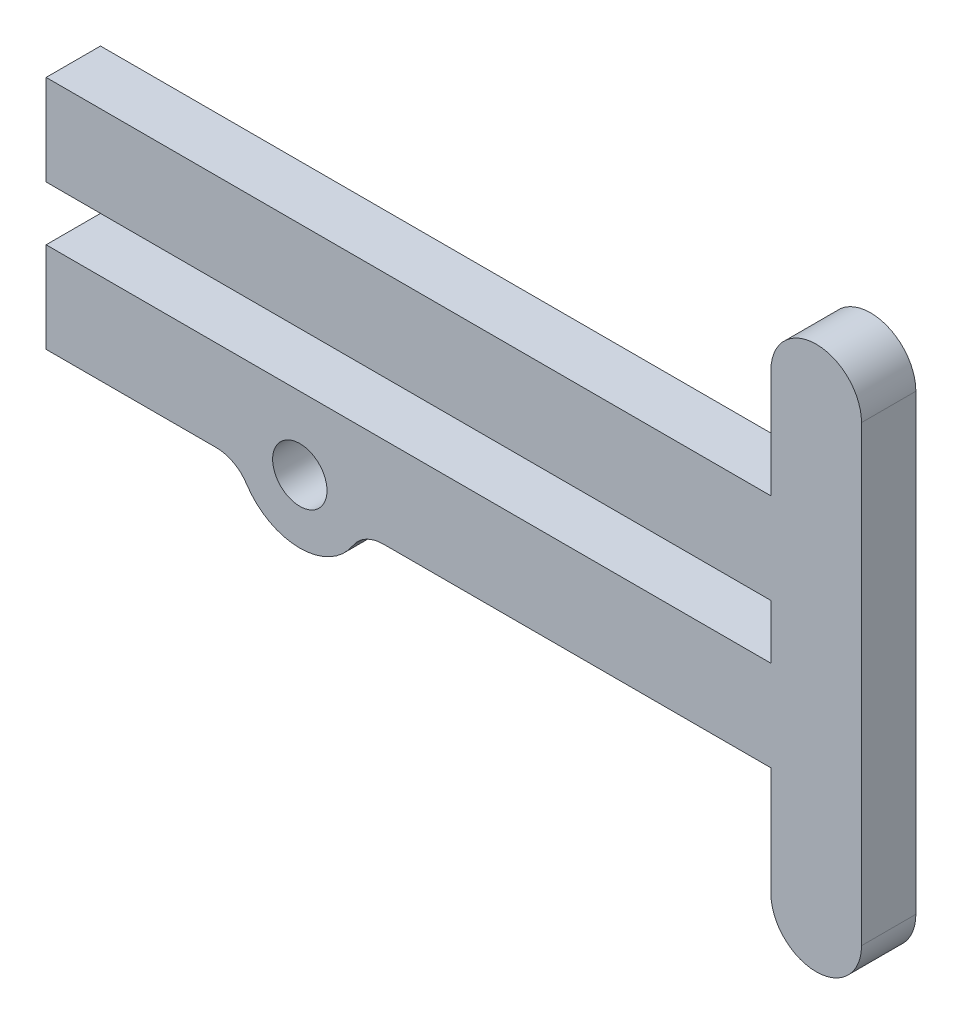
ISO-10303-21;
HEADER;
FILE_DESCRIPTION(('STEP AP214'),'2;1');
FILE_NAME('part.step','',(''),(''),'','','');
FILE_SCHEMA(('AUTOMOTIVE_DESIGN { 1 0 10303 214 1 1 1 1 }'));
ENDSEC;
DATA;
#1=APPLICATION_CONTEXT('core data for automotive mechanical design processes');
#2=APPLICATION_PROTOCOL_DEFINITION('international standard','automotive_design',2000,#1);
#3=PRODUCT_CONTEXT('',#1,'mechanical');
#4=PRODUCT('Part','Part','',(#3));
#5=PRODUCT_RELATED_PRODUCT_CATEGORY('part','',(#4));
#6=PRODUCT_DEFINITION_FORMATION('','',#4);
#7=PRODUCT_DEFINITION_CONTEXT('part definition',#1,'design');
#8=PRODUCT_DEFINITION('design','',#6,#7);
#9=PRODUCT_DEFINITION_SHAPE('','',#8);
#10=(LENGTH_UNIT() NAMED_UNIT(*) SI_UNIT(.MILLI.,.METRE.));
#11=(NAMED_UNIT(*) PLANE_ANGLE_UNIT() SI_UNIT($,.RADIAN.));
#12=(NAMED_UNIT(*) SI_UNIT($,.STERADIAN.) SOLID_ANGLE_UNIT());
#13=UNCERTAINTY_MEASURE_WITH_UNIT(LENGTH_MEASURE(1.E-05),#10,'distance_accuracy_value','');
#14=(GEOMETRIC_REPRESENTATION_CONTEXT(3) GLOBAL_UNCERTAINTY_ASSIGNED_CONTEXT((#13)) GLOBAL_UNIT_ASSIGNED_CONTEXT((#10,
#11,#12)) REPRESENTATION_CONTEXT('',''));
#15=CARTESIAN_POINT('',(0.,0.,0.));
#16=DIRECTION('',(0.,0.,1.));
#17=DIRECTION('',(1.,0.,0.));
#18=AXIS2_PLACEMENT_3D('',#15,#16,#17);
#19=CARTESIAN_POINT('',(0.,-13.,3.));
#20=DIRECTION('',(0.,1.,0.));
#21=DIRECTION('',(-1.,0.,0.));
#22=AXIS2_PLACEMENT_3D('',#19,#20,#21);
#23=PLANE('',#22);
#24=DIRECTION('',(1.,0.,0.));
#25=VECTOR('',#24,1.);
#26=CARTESIAN_POINT('',(0.,-13.,3.));
#27=LINE('',#26,#25);
#28=CARTESIAN_POINT('',(-26.3902277713535,-13.,3.));
#29=VERTEX_POINT('',#28);
#30=CARTESIAN_POINT('',(-5.,-13.,3.));
#31=VERTEX_POINT('',#30);
#32=EDGE_CURVE('E217',#29,#31,#27,.T.);
#33=ORIENTED_EDGE('',*,*,#32,.F.);
#34=DIRECTION('',(0.,0.,1.));
#35=VECTOR('',#34,1.);
#36=CARTESIAN_POINT('',(-26.3902277713536,-13.,3.));
#37=LINE('',#36,#35);
#38=CARTESIAN_POINT('',(-26.3902277713535,-13.,0.));
#39=VERTEX_POINT('',#38);
#40=EDGE_CURVE('E267',#29,#39,#37,.F.);
#41=ORIENTED_EDGE('',*,*,#40,.T.);
#42=DIRECTION('',(1.,0.,0.));
#43=VECTOR('',#42,1.);
#44=CARTESIAN_POINT('',(0.,-13.,0.));
#45=LINE('',#44,#43);
#46=CARTESIAN_POINT('',(-5.,-13.,0.));
#47=VERTEX_POINT('',#46);
#48=EDGE_CURVE('E236',#39,#47,#45,.T.);
#49=ORIENTED_EDGE('',*,*,#48,.T.);
#50=DIRECTION('',(0.,0.,-1.));
#51=VECTOR('',#50,1.);
#52=CARTESIAN_POINT('',(-5.,-13.,3.));
#53=LINE('',#52,#51);
#54=EDGE_CURVE('E191',#31,#47,#53,.T.);
#55=ORIENTED_EDGE('',*,*,#54,.F.);
#56=EDGE_LOOP('',(#33,#41,#49,#55));
#57=FACE_BOUND('',#56,.T.);
#58=ADVANCED_FACE('F35',(#57),#23,.F.);
#59=CARTESIAN_POINT('',(-45.,0.,3.));
#60=DIRECTION('',(0.,-1.,0.));
#61=DIRECTION('',(0.,0.,-1.));
#62=AXIS2_PLACEMENT_3D('',#59,#60,#61);
#63=PLANE('',#62);
#64=DIRECTION('',(0.,0.,1.));
#65=VECTOR('',#64,1.);
#66=CARTESIAN_POINT('',(-5.,0.,3.));
#67=LINE('',#66,#65);
#68=CARTESIAN_POINT('',(-5.,0.,0.));
#69=VERTEX_POINT('',#68);
#70=CARTESIAN_POINT('',(-5.00000000000001,0.,3.));
#71=VERTEX_POINT('',#70);
#72=EDGE_CURVE('E189',#69,#71,#67,.T.);
#73=ORIENTED_EDGE('',*,*,#72,.F.);
#74=DIRECTION('',(-1.,0.,0.));
#75=VECTOR('',#74,1.);
#76=CARTESIAN_POINT('',(-45.,0.,0.));
#77=LINE('',#76,#75);
#78=CARTESIAN_POINT('',(-45.,0.,0.));
#79=VERTEX_POINT('',#78);
#80=EDGE_CURVE('E168',#69,#79,#77,.T.);
#81=ORIENTED_EDGE('',*,*,#80,.T.);
#82=DIRECTION('',(0.,0.,-1.));
#83=VECTOR('',#82,1.);
#84=CARTESIAN_POINT('',(-45.,0.,3.));
#85=LINE('',#84,#83);
#86=CARTESIAN_POINT('',(-45.,0.,3.));
#87=VERTEX_POINT('',#86);
#88=EDGE_CURVE('E225',#87,#79,#85,.T.);
#89=ORIENTED_EDGE('',*,*,#88,.F.);
#90=DIRECTION('',(-1.,0.,0.));
#91=VECTOR('',#90,1.);
#92=CARTESIAN_POINT('',(-45.,0.,3.));
#93=LINE('',#92,#91);
#94=EDGE_CURVE('E223',#71,#87,#93,.T.);
#95=ORIENTED_EDGE('',*,*,#94,.F.);
#96=EDGE_LOOP('',(#73,#81,#89,#95));
#97=FACE_BOUND('',#96,.T.);
#98=ADVANCED_FACE('F313',(#97),#63,.F.);
#99=CARTESIAN_POINT('',(-45.,-13.,0.));
#100=VERTEX_POINT('',#99);
#101=CARTESIAN_POINT('',(-35.6097722286464,-13.,0.));
#102=VERTEX_POINT('',#101);
#103=EDGE_CURVE('E237',#100,#102,#45,.T.);
#104=ORIENTED_EDGE('',*,*,#103,.T.);
#105=DIRECTION('',(0.,0.,1.));
#106=VECTOR('',#105,1.);
#107=CARTESIAN_POINT('',(-35.6097722286464,-13.,3.));
#108=LINE('',#107,#106);
#109=CARTESIAN_POINT('',(-35.6097722286464,-13.,3.));
#110=VERTEX_POINT('',#109);
#111=EDGE_CURVE('E260',#102,#110,#108,.T.);
#112=ORIENTED_EDGE('',*,*,#111,.T.);
#113=CARTESIAN_POINT('',(-45.,-13.,3.));
#114=VERTEX_POINT('',#113);
#115=EDGE_CURVE('E218',#114,#110,#27,.T.);
#116=ORIENTED_EDGE('',*,*,#115,.F.);
#117=DIRECTION('',(0.,0.,-1.));
#118=VECTOR('',#117,1.);
#119=CARTESIAN_POINT('',(-45.,-13.,3.));
#120=LINE('',#119,#118);
#121=EDGE_CURVE('E245',#114,#100,#120,.T.);
#122=ORIENTED_EDGE('',*,*,#121,.T.);
#123=EDGE_LOOP('',(#104,#112,#116,#122));
#124=FACE_BOUND('',#123,.T.);
#125=ADVANCED_FACE('F314',(#124),#23,.F.);
#126=CARTESIAN_POINT('',(-45.,-5.,3.));
#127=DIRECTION('',(1.,0.,0.));
#128=DIRECTION('',(0.,0.,-1.));
#129=AXIS2_PLACEMENT_3D('',#126,#127,#128);
#130=PLANE('',#129);
#131=DIRECTION('',(0.,-1.,0.));
#132=VECTOR('',#131,1.);
#133=CARTESIAN_POINT('',(-45.,-5.,0.));
#134=LINE('',#133,#132);
#135=CARTESIAN_POINT('',(-45.,-5.,0.));
#136=VERTEX_POINT('',#135);
#137=EDGE_CURVE('E205',#79,#136,#134,.T.);
#138=ORIENTED_EDGE('',*,*,#137,.T.);
#139=DIRECTION('',(0.,0.,-1.));
#140=VECTOR('',#139,1.);
#141=CARTESIAN_POINT('',(-45.,-5.,3.));
#142=LINE('',#141,#140);
#143=CARTESIAN_POINT('',(-45.,-5.,3.));
#144=VERTEX_POINT('',#143);
#145=EDGE_CURVE('E257',#144,#136,#142,.T.);
#146=ORIENTED_EDGE('',*,*,#145,.F.);
#147=DIRECTION('',(0.,-1.,0.));
#148=VECTOR('',#147,1.);
#149=CARTESIAN_POINT('',(-45.,-5.,3.));
#150=LINE('',#149,#148);
#151=EDGE_CURVE('E206',#87,#144,#150,.T.);
#152=ORIENTED_EDGE('',*,*,#151,.F.);
#153=ORIENTED_EDGE('',*,*,#88,.T.);
#154=EDGE_LOOP('',(#138,#146,#152,#153));
#155=FACE_BOUND('',#154,.T.);
#156=ADVANCED_FACE('F321',(#155),#130,.F.);
#157=CARTESIAN_POINT('',(-5.,-5.,3.));
#158=DIRECTION('',(0.,1.,0.));
#159=DIRECTION('',(-1.,0.,0.));
#160=AXIS2_PLACEMENT_3D('',#157,#158,#159);
#161=PLANE('',#160);
#162=DIRECTION('',(1.,0.,0.));
#163=VECTOR('',#162,1.);
#164=CARTESIAN_POINT('',(-5.,-5.,0.));
#165=LINE('',#164,#163);
#166=CARTESIAN_POINT('',(-5.,-5.,0.));
#167=VERTEX_POINT('',#166);
#168=EDGE_CURVE('E228',#136,#167,#165,.T.);
#169=ORIENTED_EDGE('',*,*,#168,.T.);
#170=DIRECTION('',(0.,0.,-1.));
#171=VECTOR('',#170,1.);
#172=CARTESIAN_POINT('',(-5.,-5.,3.));
#173=LINE('',#172,#171);
#174=CARTESIAN_POINT('',(-5.,-5.,3.));
#175=VERTEX_POINT('',#174);
#176=EDGE_CURVE('E254',#175,#167,#173,.T.);
#177=ORIENTED_EDGE('',*,*,#176,.F.);
#178=DIRECTION('',(1.,0.,0.));
#179=VECTOR('',#178,1.);
#180=CARTESIAN_POINT('',(-5.,-5.,3.));
#181=LINE('',#180,#179);
#182=EDGE_CURVE('E209',#144,#175,#181,.T.);
#183=ORIENTED_EDGE('',*,*,#182,.F.);
#184=ORIENTED_EDGE('',*,*,#145,.T.);
#185=EDGE_LOOP('',(#169,#177,#183,#184));
#186=FACE_BOUND('',#185,.T.);
#187=ADVANCED_FACE('F326',(#186),#161,.F.);
#188=CARTESIAN_POINT('',(-5.,-8.,3.));
#189=DIRECTION('',(1.,0.,0.));
#190=DIRECTION('',(0.,0.,-1.));
#191=AXIS2_PLACEMENT_3D('',#188,#189,#190);
#192=PLANE('',#191);
#193=DIRECTION('',(0.,-1.,0.));
#194=VECTOR('',#193,1.);
#195=CARTESIAN_POINT('',(-5.,-8.,0.));
#196=LINE('',#195,#194);
#197=CARTESIAN_POINT('',(-5.,-8.,0.));
#198=VERTEX_POINT('',#197);
#199=EDGE_CURVE('E230',#167,#198,#196,.T.);
#200=ORIENTED_EDGE('',*,*,#199,.T.);
#201=DIRECTION('',(0.,0.,-1.));
#202=VECTOR('',#201,1.);
#203=CARTESIAN_POINT('',(-5.,-8.,3.));
#204=LINE('',#203,#202);
#205=CARTESIAN_POINT('',(-5.,-8.,3.));
#206=VERTEX_POINT('',#205);
#207=EDGE_CURVE('E251',#206,#198,#204,.T.);
#208=ORIENTED_EDGE('',*,*,#207,.F.);
#209=DIRECTION('',(0.,-1.,0.));
#210=VECTOR('',#209,1.);
#211=CARTESIAN_POINT('',(-5.,-8.,3.));
#212=LINE('',#211,#210);
#213=EDGE_CURVE('E211',#175,#206,#212,.T.);
#214=ORIENTED_EDGE('',*,*,#213,.F.);
#215=ORIENTED_EDGE('',*,*,#176,.T.);
#216=EDGE_LOOP('',(#200,#208,#214,#215));
#217=FACE_BOUND('',#216,.T.);
#218=ADVANCED_FACE('F344',(#217),#192,.F.);
#219=CARTESIAN_POINT('',(-45.,-8.,3.));
#220=DIRECTION('',(0.,-1.,0.));
#221=DIRECTION('',(0.,0.,-1.));
#222=AXIS2_PLACEMENT_3D('',#219,#220,#221);
#223=PLANE('',#222);
#224=DIRECTION('',(-1.,0.,0.));
#225=VECTOR('',#224,1.);
#226=CARTESIAN_POINT('',(-45.,-8.,0.));
#227=LINE('',#226,#225);
#228=CARTESIAN_POINT('',(-45.,-8.,0.));
#229=VERTEX_POINT('',#228);
#230=EDGE_CURVE('E232',#198,#229,#227,.T.);
#231=ORIENTED_EDGE('',*,*,#230,.T.);
#232=DIRECTION('',(0.,0.,-1.));
#233=VECTOR('',#232,1.);
#234=CARTESIAN_POINT('',(-45.,-8.,3.));
#235=LINE('',#234,#233);
#236=CARTESIAN_POINT('',(-45.,-8.,3.));
#237=VERTEX_POINT('',#236);
#238=EDGE_CURVE('E248',#237,#229,#235,.T.);
#239=ORIENTED_EDGE('',*,*,#238,.F.);
#240=DIRECTION('',(-1.,0.,0.));
#241=VECTOR('',#240,1.);
#242=CARTESIAN_POINT('',(-45.,-8.,3.));
#243=LINE('',#242,#241);
#244=EDGE_CURVE('E213',#206,#237,#243,.T.);
#245=ORIENTED_EDGE('',*,*,#244,.F.);
#246=ORIENTED_EDGE('',*,*,#207,.T.);
#247=EDGE_LOOP('',(#231,#239,#245,#246));
#248=FACE_BOUND('',#247,.T.);
#249=ADVANCED_FACE('F307',(#248),#223,.F.);
#250=CARTESIAN_POINT('',(-45.,-13.,3.));
#251=DIRECTION('',(1.,0.,0.));
#252=DIRECTION('',(0.,0.,-1.));
#253=AXIS2_PLACEMENT_3D('',#250,#251,#252);
#254=PLANE('',#253);
#255=DIRECTION('',(0.,-1.,0.));
#256=VECTOR('',#255,1.);
#257=CARTESIAN_POINT('',(-45.,-13.,0.));
#258=LINE('',#257,#256);
#259=EDGE_CURVE('E234',#229,#100,#258,.T.);
#260=ORIENTED_EDGE('',*,*,#259,.T.);
#261=ORIENTED_EDGE('',*,*,#121,.F.);
#262=DIRECTION('',(0.,-1.,0.));
#263=VECTOR('',#262,1.);
#264=CARTESIAN_POINT('',(-45.,-13.,3.));
#265=LINE('',#264,#263);
#266=EDGE_CURVE('E215',#237,#114,#265,.T.);
#267=ORIENTED_EDGE('',*,*,#266,.F.);
#268=ORIENTED_EDGE('',*,*,#238,.T.);
#269=EDGE_LOOP('',(#260,#261,#267,#268));
#270=FACE_BOUND('',#269,.T.);
#271=ADVANCED_FACE('F299',(#270),#254,.F.);
#272=CARTESIAN_POINT('',(0.,0.,3.));
#273=DIRECTION('',(-1.,0.,0.));
#274=DIRECTION('',(0.,-1.,0.));
#275=AXIS2_PLACEMENT_3D('',#272,#273,#274);
#276=PLANE('',#275);
#277=DIRECTION('',(0.,1.,0.));
#278=VECTOR('',#277,1.);
#279=CARTESIAN_POINT('',(0.,0.,0.));
#280=LINE('',#279,#278);
#281=CARTESIAN_POINT('',(0.,-19.,0.));
#282=VERTEX_POINT('',#281);
#283=CARTESIAN_POINT('',(0.,6.,0.));
#284=VERTEX_POINT('',#283);
#285=EDGE_CURVE('E240',#282,#284,#280,.T.);
#286=ORIENTED_EDGE('',*,*,#285,.T.);
#287=DIRECTION('',(0.,0.,-1.));
#288=VECTOR('',#287,1.);
#289=CARTESIAN_POINT('',(0.,6.,33.4138126514911));
#290=LINE('',#289,#288);
#291=CARTESIAN_POINT('',(0.,6.,3.));
#292=VERTEX_POINT('',#291);
#293=EDGE_CURVE('E175',#292,#284,#290,.T.);
#294=ORIENTED_EDGE('',*,*,#293,.F.);
#295=DIRECTION('',(0.,1.,0.));
#296=VECTOR('',#295,1.);
#297=CARTESIAN_POINT('',(0.,0.,3.));
#298=LINE('',#297,#296);
#299=CARTESIAN_POINT('',(0.,-19.,3.));
#300=VERTEX_POINT('',#299);
#301=EDGE_CURVE('E221',#300,#292,#298,.T.);
#302=ORIENTED_EDGE('',*,*,#301,.F.);
#303=DIRECTION('',(0.,0.,-1.));
#304=VECTOR('',#303,1.);
#305=CARTESIAN_POINT('',(0.,-19.,33.4138126514911));
#306=LINE('',#305,#304);
#307=EDGE_CURVE('E184',#300,#282,#306,.T.);
#308=ORIENTED_EDGE('',*,*,#307,.T.);
#309=EDGE_LOOP('',(#286,#294,#302,#308));
#310=FACE_BOUND('',#309,.T.);
#311=ADVANCED_FACE('F297',(#310),#276,.F.);
#312=CARTESIAN_POINT('',(0.,0.,3.));
#313=DIRECTION('',(0.,0.,-1.));
#314=DIRECTION('',(-1.,0.,0.));
#315=AXIS2_PLACEMENT_3D('',#312,#313,#314);
#316=PLANE('',#315);
#317=ORIENTED_EDGE('',*,*,#301,.T.);
#318=CARTESIAN_POINT('',(-2.5,6.,3.));
#319=DIRECTION('',(0.,0.,-1.));
#320=DIRECTION('',(-1.,0.,0.));
#321=AXIS2_PLACEMENT_3D('',#318,#319,#320);
#322=CIRCLE('',#321,2.5);
#323=CARTESIAN_POINT('',(-5.,6.,3.));
#324=VERTEX_POINT('',#323);
#325=EDGE_CURVE('E178',#324,#292,#322,.T.);
#326=ORIENTED_EDGE('',*,*,#325,.F.);
#327=DIRECTION('',(0.,1.,0.));
#328=VECTOR('',#327,1.);
#329=CARTESIAN_POINT('',(-5.,6.,3.));
#330=LINE('',#329,#328);
#331=EDGE_CURVE('E152',#71,#324,#330,.T.);
#332=ORIENTED_EDGE('',*,*,#331,.F.);
#333=ORIENTED_EDGE('',*,*,#94,.T.);
#334=ORIENTED_EDGE('',*,*,#151,.T.);
#335=ORIENTED_EDGE('',*,*,#182,.T.);
#336=ORIENTED_EDGE('',*,*,#213,.T.);
#337=ORIENTED_EDGE('',*,*,#244,.T.);
#338=ORIENTED_EDGE('',*,*,#266,.T.);
#339=ORIENTED_EDGE('',*,*,#115,.T.);
#340=CARTESIAN_POINT('',(-35.6097722286464,-15.,3.));
#341=DIRECTION('',(0.,0.,-1.));
#342=DIRECTION('',(-1.,0.,0.));
#343=AXIS2_PLACEMENT_3D('',#340,#341,#342);
#344=CIRCLE('',#343,2.);
#345=CARTESIAN_POINT('',(-33.9334914182296,-13.9090909090909,3.));
#346=VERTEX_POINT('',#345);
#347=EDGE_CURVE('E269',#110,#346,#344,.T.);
#348=ORIENTED_EDGE('',*,*,#347,.T.);
#349=CARTESIAN_POINT('',(-31.,-12.,3.));
#350=DIRECTION('',(0.,0.,1.));
#351=DIRECTION('',(1.,0.,0.));
#352=AXIS2_PLACEMENT_3D('',#349,#350,#351);
#353=CIRCLE('',#352,3.5);
#354=CARTESIAN_POINT('',(-28.0665085817704,-13.9090909090909,3.));
#355=VERTEX_POINT('',#354);
#356=EDGE_CURVE('E198',#346,#355,#353,.T.);
#357=ORIENTED_EDGE('',*,*,#356,.T.);
#358=CARTESIAN_POINT('',(-26.3902277713536,-15.,3.));
#359=DIRECTION('',(0.,0.,-1.));
#360=DIRECTION('',(-1.,0.,0.));
#361=AXIS2_PLACEMENT_3D('',#358,#359,#360);
#362=CIRCLE('',#361,2.);
#363=EDGE_CURVE('E11',#355,#29,#362,.T.);
#364=ORIENTED_EDGE('',*,*,#363,.T.);
#365=ORIENTED_EDGE('',*,*,#32,.T.);
#366=CARTESIAN_POINT('',(-5.,-19.,3.));
#367=VERTEX_POINT('',#366);
#368=EDGE_CURVE('E286',#367,#31,#330,.T.);
#369=ORIENTED_EDGE('',*,*,#368,.F.);
#370=CARTESIAN_POINT('',(-2.5,-19.,3.));
#371=DIRECTION('',(0.,0.,-1.));
#372=DIRECTION('',(-1.,0.,0.));
#373=AXIS2_PLACEMENT_3D('',#370,#371,#372);
#374=CIRCLE('',#373,2.5);
#375=EDGE_CURVE('E157',#300,#367,#374,.T.);
#376=ORIENTED_EDGE('',*,*,#375,.F.);
#377=EDGE_LOOP('',(#317,#326,#332,#333,#334,#335,#336,#337,#338,#339,#348,#357,#364,#365,#369,#376));
#378=FACE_BOUND('',#377,.T.);
#379=CARTESIAN_POINT('',(-31.,-12.,3.));
#380=DIRECTION('',(0.,0.,1.));
#381=DIRECTION('',(1.,0.,0.));
#382=AXIS2_PLACEMENT_3D('',#379,#380,#381);
#383=CIRCLE('',#382,1.5);
#384=CARTESIAN_POINT('',(-29.5,-12.,3.));
#385=VERTEX_POINT('',#384);
#386=EDGE_CURVE('E194',#385,#385,#383,.T.);
#387=ORIENTED_EDGE('',*,*,#386,.F.);
#388=EDGE_LOOP('',(#387));
#389=FACE_BOUND('',#388,.T.);
#390=ADVANCED_FACE('F283',(#378,#389),#316,.F.);
#391=CARTESIAN_POINT('',(0.,0.,0.));
#392=DIRECTION('',(0.,0.,-1.));
#393=DIRECTION('',(-1.,0.,0.));
#394=AXIS2_PLACEMENT_3D('',#391,#392,#393);
#395=PLANE('',#394);
#396=ORIENTED_EDGE('',*,*,#199,.F.);
#397=ORIENTED_EDGE('',*,*,#168,.F.);
#398=ORIENTED_EDGE('',*,*,#137,.F.);
#399=ORIENTED_EDGE('',*,*,#80,.F.);
#400=DIRECTION('',(0.,-1.,0.));
#401=VECTOR('',#400,1.);
#402=CARTESIAN_POINT('',(-5.,6.,0.));
#403=LINE('',#402,#401);
#404=CARTESIAN_POINT('',(-5.,6.,0.));
#405=VERTEX_POINT('',#404);
#406=EDGE_CURVE('E150',#405,#69,#403,.T.);
#407=ORIENTED_EDGE('',*,*,#406,.F.);
#408=CARTESIAN_POINT('',(-2.5,6.,0.));
#409=DIRECTION('',(0.,0.,1.));
#410=DIRECTION('',(1.,0.,0.));
#411=AXIS2_PLACEMENT_3D('',#408,#409,#410);
#412=CIRCLE('',#411,2.5);
#413=EDGE_CURVE('E166',#284,#405,#412,.T.);
#414=ORIENTED_EDGE('',*,*,#413,.F.);
#415=ORIENTED_EDGE('',*,*,#285,.F.);
#416=CARTESIAN_POINT('',(-2.5,-19.,0.));
#417=DIRECTION('',(0.,0.,1.));
#418=DIRECTION('',(1.,0.,0.));
#419=AXIS2_PLACEMENT_3D('',#416,#417,#418);
#420=CIRCLE('',#419,2.5);
#421=CARTESIAN_POINT('',(-5.,-19.,0.));
#422=VERTEX_POINT('',#421);
#423=EDGE_CURVE('E169',#422,#282,#420,.T.);
#424=ORIENTED_EDGE('',*,*,#423,.F.);
#425=EDGE_CURVE('E170',#47,#422,#403,.T.);
#426=ORIENTED_EDGE('',*,*,#425,.F.);
#427=ORIENTED_EDGE('',*,*,#48,.F.);
#428=CARTESIAN_POINT('',(-26.3902277713536,-15.,0.));
#429=DIRECTION('',(0.,0.,-1.));
#430=DIRECTION('',(-1.,0.,0.));
#431=AXIS2_PLACEMENT_3D('',#428,#429,#430);
#432=CIRCLE('',#431,2.);
#433=CARTESIAN_POINT('',(-28.0665085817704,-13.9090909090909,0.));
#434=VERTEX_POINT('',#433);
#435=EDGE_CURVE('E43',#39,#434,#432,.F.);
#436=ORIENTED_EDGE('',*,*,#435,.T.);
#437=CARTESIAN_POINT('',(-31.,-12.,0.));
#438=DIRECTION('',(0.,0.,-1.));
#439=DIRECTION('',(-1.,0.,0.));
#440=AXIS2_PLACEMENT_3D('',#437,#438,#439);
#441=CIRCLE('',#440,3.5);
#442=CARTESIAN_POINT('',(-33.9334914182296,-13.9090909090909,0.));
#443=VERTEX_POINT('',#442);
#444=EDGE_CURVE('E202',#443,#434,#441,.F.);
#445=ORIENTED_EDGE('',*,*,#444,.F.);
#446=CARTESIAN_POINT('',(-35.6097722286464,-15.,0.));
#447=DIRECTION('',(0.,0.,-1.));
#448=DIRECTION('',(-1.,0.,0.));
#449=AXIS2_PLACEMENT_3D('',#446,#447,#448);
#450=CIRCLE('',#449,2.);
#451=EDGE_CURVE('E271',#443,#102,#450,.F.);
#452=ORIENTED_EDGE('',*,*,#451,.T.);
#453=ORIENTED_EDGE('',*,*,#103,.F.);
#454=ORIENTED_EDGE('',*,*,#259,.F.);
#455=ORIENTED_EDGE('',*,*,#230,.F.);
#456=EDGE_LOOP('',(#396,#397,#398,#399,#407,#414,#415,#424,#426,#427,#436,#445,#452,#453,#454,#455));
#457=FACE_BOUND('',#456,.T.);
#458=CARTESIAN_POINT('',(-31.,-12.,0.));
#459=DIRECTION('',(0.,0.,1.));
#460=DIRECTION('',(1.,0.,0.));
#461=AXIS2_PLACEMENT_3D('',#458,#459,#460);
#462=CIRCLE('',#461,1.5);
#463=CARTESIAN_POINT('',(-29.5,-12.,0.));
#464=VERTEX_POINT('',#463);
#465=EDGE_CURVE('E195',#464,#464,#462,.T.);
#466=ORIENTED_EDGE('',*,*,#465,.T.);
#467=EDGE_LOOP('',(#466));
#468=FACE_BOUND('',#467,.T.);
#469=ADVANCED_FACE('F164',(#457,#468),#395,.T.);
#470=CARTESIAN_POINT('',(-31.,-12.,-9.89949493661167));
#471=DIRECTION('',(0.,0.,1.));
#472=DIRECTION('',(1.,0.,0.));
#473=AXIS2_PLACEMENT_3D('',#470,#471,#472);
#474=CYLINDRICAL_SURFACE('',#473,3.5);
#475=ORIENTED_EDGE('',*,*,#356,.F.);
#476=DIRECTION('',(0.,0.,1.));
#477=VECTOR('',#476,1.);
#478=CARTESIAN_POINT('',(-33.9334914182296,-13.9090909090909,-9.89949493661167));
#479=LINE('',#478,#477);
#480=EDGE_CURVE('E265',#346,#443,#479,.F.);
#481=ORIENTED_EDGE('',*,*,#480,.T.);
#482=ORIENTED_EDGE('',*,*,#444,.T.);
#483=DIRECTION('',(0.,0.,1.));
#484=VECTOR('',#483,1.);
#485=CARTESIAN_POINT('',(-28.0665085817704,-13.9090909090909,-9.89949493661167));
#486=LINE('',#485,#484);
#487=EDGE_CURVE('E263',#434,#355,#486,.T.);
#488=ORIENTED_EDGE('',*,*,#487,.T.);
#489=EDGE_LOOP('',(#475,#481,#482,#488));
#490=FACE_BOUND('',#489,.T.);
#491=ADVANCED_FACE('F278',(#490),#474,.T.);
#492=CARTESIAN_POINT('',(-31.,-12.,0.));
#493=DIRECTION('',(0.,0.,1.));
#494=DIRECTION('',(1.,0.,0.));
#495=AXIS2_PLACEMENT_3D('',#492,#493,#494);
#496=CYLINDRICAL_SURFACE('',#495,1.5);
#497=ORIENTED_EDGE('',*,*,#465,.F.);
#498=EDGE_LOOP('',(#497));
#499=FACE_BOUND('',#498,.T.);
#500=ORIENTED_EDGE('',*,*,#386,.T.);
#501=EDGE_LOOP('',(#500));
#502=FACE_BOUND('',#501,.T.);
#503=ADVANCED_FACE('F370',(#499,#502),#496,.F.);
#504=CARTESIAN_POINT('',(-2.5,6.,33.4138126514911));
#505=DIRECTION('',(0.,0.,-1.));
#506=DIRECTION('',(-1.,0.,0.));
#507=AXIS2_PLACEMENT_3D('',#504,#505,#506);
#508=CYLINDRICAL_SURFACE('',#507,2.5);
#509=DIRECTION('',(0.,0.,-1.));
#510=VECTOR('',#509,1.);
#511=CARTESIAN_POINT('',(-5.,6.,33.4138126514911));
#512=LINE('',#511,#510);
#513=EDGE_CURVE('E146',#324,#405,#512,.T.);
#514=ORIENTED_EDGE('',*,*,#513,.F.);
#515=ORIENTED_EDGE('',*,*,#325,.T.);
#516=ORIENTED_EDGE('',*,*,#293,.T.);
#517=ORIENTED_EDGE('',*,*,#413,.T.);
#518=EDGE_LOOP('',(#514,#515,#516,#517));
#519=FACE_BOUND('',#518,.T.);
#520=ADVANCED_FACE('F173',(#519),#508,.T.);
#521=CARTESIAN_POINT('',(-5.,6.,33.4138126514911));
#522=DIRECTION('',(1.,0.,0.));
#523=DIRECTION('',(0.,0.,-1.));
#524=AXIS2_PLACEMENT_3D('',#521,#522,#523);
#525=PLANE('',#524);
#526=ORIENTED_EDGE('',*,*,#406,.T.);
#527=ORIENTED_EDGE('',*,*,#72,.T.);
#528=ORIENTED_EDGE('',*,*,#331,.T.);
#529=ORIENTED_EDGE('',*,*,#513,.T.);
#530=EDGE_LOOP('',(#526,#527,#528,#529));
#531=FACE_BOUND('',#530,.T.);
#532=ADVANCED_FACE('F148',(#531),#525,.F.);
#533=ORIENTED_EDGE('',*,*,#368,.T.);
#534=ORIENTED_EDGE('',*,*,#54,.T.);
#535=ORIENTED_EDGE('',*,*,#425,.T.);
#536=DIRECTION('',(0.,0.,-1.));
#537=VECTOR('',#536,1.);
#538=CARTESIAN_POINT('',(-5.,-19.,33.4138126514911));
#539=LINE('',#538,#537);
#540=EDGE_CURVE('E158',#367,#422,#539,.T.);
#541=ORIENTED_EDGE('',*,*,#540,.F.);
#542=EDGE_LOOP('',(#533,#534,#535,#541));
#543=FACE_BOUND('',#542,.T.);
#544=ADVANCED_FACE('F289',(#543),#525,.F.);
#545=CARTESIAN_POINT('',(-2.5,-19.,33.4138126514911));
#546=DIRECTION('',(0.,0.,-1.));
#547=DIRECTION('',(-1.,0.,0.));
#548=AXIS2_PLACEMENT_3D('',#545,#546,#547);
#549=CYLINDRICAL_SURFACE('',#548,2.5);
#550=ORIENTED_EDGE('',*,*,#307,.F.);
#551=ORIENTED_EDGE('',*,*,#375,.T.);
#552=ORIENTED_EDGE('',*,*,#540,.T.);
#553=ORIENTED_EDGE('',*,*,#423,.T.);
#554=EDGE_LOOP('',(#550,#551,#552,#553));
#555=FACE_BOUND('',#554,.T.);
#556=ADVANCED_FACE('F294',(#555),#549,.T.);
#557=CARTESIAN_POINT('',(-35.6097722286464,-15.,-9.89949493661167));
#558=DIRECTION('',(0.,0.,1.));
#559=DIRECTION('',(1.,0.,0.));
#560=AXIS2_PLACEMENT_3D('',#557,#558,#559);
#561=CYLINDRICAL_SURFACE('',#560,2.);
#562=ORIENTED_EDGE('',*,*,#451,.F.);
#563=ORIENTED_EDGE('',*,*,#480,.F.);
#564=ORIENTED_EDGE('',*,*,#347,.F.);
#565=ORIENTED_EDGE('',*,*,#111,.F.);
#566=EDGE_LOOP('',(#562,#563,#564,#565));
#567=FACE_BOUND('',#566,.T.);
#568=ADVANCED_FACE('F335',(#567),#561,.F.);
#569=CARTESIAN_POINT('',(-26.3902277713536,-15.,-9.89949493661167));
#570=DIRECTION('',(0.,0.,1.));
#571=DIRECTION('',(1.,0.,0.));
#572=AXIS2_PLACEMENT_3D('',#569,#570,#571);
#573=CYLINDRICAL_SURFACE('',#572,2.);
#574=ORIENTED_EDGE('',*,*,#363,.F.);
#575=ORIENTED_EDGE('',*,*,#487,.F.);
#576=ORIENTED_EDGE('',*,*,#435,.F.);
#577=ORIENTED_EDGE('',*,*,#40,.F.);
#578=EDGE_LOOP('',(#574,#575,#576,#577));
#579=FACE_BOUND('',#578,.T.);
#580=ADVANCED_FACE('F37',(#579),#573,.F.);
#581=CLOSED_SHELL('',(#58,#98,#125,#156,#187,#218,#249,#271,#311,#390,#469,#491,#503,#520,#532,
#544,#556,#568,#580));
#582=MANIFOLD_SOLID_BREP('B2',#581);
#583=ADVANCED_BREP_SHAPE_REPRESENTATION('',(#18,#582),#14);
#584=SHAPE_DEFINITION_REPRESENTATION(#9,#583);
ENDSEC;
END-ISO-10303-21;
